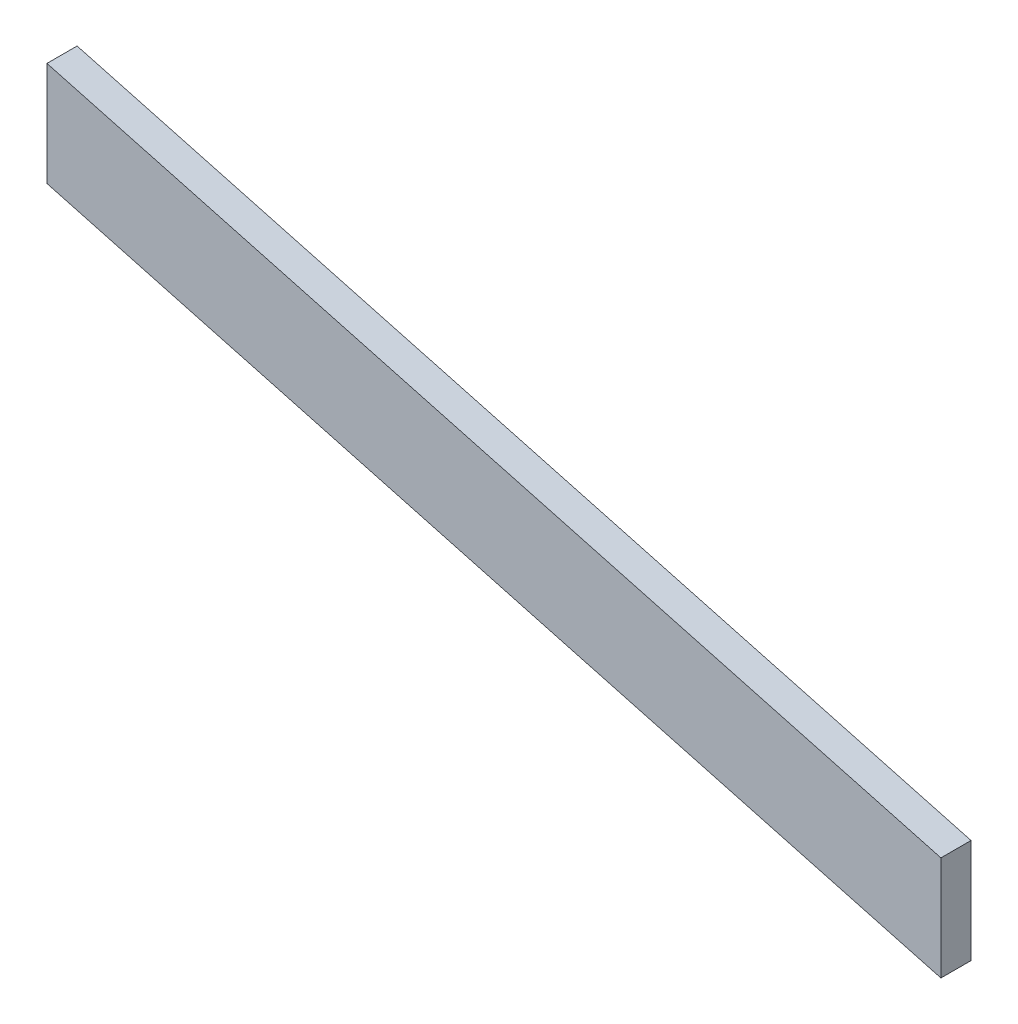
ISO-10303-21;
HEADER;
FILE_DESCRIPTION(('STEP AP214'),'2;1');
FILE_NAME('part.step','',(''),(''),'','','');
FILE_SCHEMA(('AUTOMOTIVE_DESIGN { 1 0 10303 214 1 1 1 1 }'));
ENDSEC;
DATA;
#1=APPLICATION_CONTEXT('core data for automotive mechanical design processes');
#2=APPLICATION_PROTOCOL_DEFINITION('international standard','automotive_design',2000,#1);
#3=PRODUCT_CONTEXT('',#1,'mechanical');
#4=PRODUCT('Part','Part','',(#3));
#5=PRODUCT_RELATED_PRODUCT_CATEGORY('part','',(#4));
#6=PRODUCT_DEFINITION_FORMATION('','',#4);
#7=PRODUCT_DEFINITION_CONTEXT('part definition',#1,'design');
#8=PRODUCT_DEFINITION('design','',#6,#7);
#9=PRODUCT_DEFINITION_SHAPE('','',#8);
#10=(LENGTH_UNIT() NAMED_UNIT(*) SI_UNIT(.MILLI.,.METRE.));
#11=(NAMED_UNIT(*) PLANE_ANGLE_UNIT() SI_UNIT($,.RADIAN.));
#12=(NAMED_UNIT(*) SI_UNIT($,.STERADIAN.) SOLID_ANGLE_UNIT());
#13=UNCERTAINTY_MEASURE_WITH_UNIT(LENGTH_MEASURE(1.E-05),#10,'distance_accuracy_value','');
#14=(GEOMETRIC_REPRESENTATION_CONTEXT(3) GLOBAL_UNCERTAINTY_ASSIGNED_CONTEXT((#13)) GLOBAL_UNIT_ASSIGNED_CONTEXT((#10,
#11,#12)) REPRESENTATION_CONTEXT('',''));
#15=CARTESIAN_POINT('',(0.,0.,0.));
#16=DIRECTION('',(0.,0.,1.));
#17=DIRECTION('',(1.,0.,0.));
#18=AXIS2_PLACEMENT_3D('',#15,#16,#17);
#19=CARTESIAN_POINT('',(-768.934498249528,966.966301204233,19.05));
#20=DIRECTION('',(-0.260362499760678,-0.965510936612512,0.));
#21=DIRECTION('',(0.965510936612513,-0.260362499760678,0.));
#22=AXIS2_PLACEMENT_3D('',#19,#20,#21);
#23=PLANE('',#22);
#24=DIRECTION('',(-0.965510936612513,0.260362499760678,0.));
#25=VECTOR('',#24,1.);
#26=CARTESIAN_POINT('',(-768.934498249528,966.966301204233,0.));
#27=LINE('',#26,#25);
#28=CARTESIAN_POINT('',(-203.784498249527,814.566301204233,0.));
#29=VERTEX_POINT('',#28);
#30=CARTESIAN_POINT('',(-768.934498249528,966.966301204233,0.));
#31=VERTEX_POINT('',#30);
#32=EDGE_CURVE('E95',#29,#31,#27,.T.);
#33=ORIENTED_EDGE('',*,*,#32,.T.);
#34=DIRECTION('',(0.,0.,-1.));
#35=VECTOR('',#34,1.);
#36=CARTESIAN_POINT('',(-768.934498249528,966.966301204233,19.05));
#37=LINE('',#36,#35);
#38=CARTESIAN_POINT('',(-768.934498249528,966.966301204233,19.05));
#39=VERTEX_POINT('',#38);
#40=EDGE_CURVE('E11',#39,#31,#37,.T.);
#41=ORIENTED_EDGE('',*,*,#40,.F.);
#42=DIRECTION('',(-0.965510936612513,0.260362499760678,0.));
#43=VECTOR('',#42,1.);
#44=CARTESIAN_POINT('',(-768.934498249528,966.966301204233,19.05));
#45=LINE('',#44,#43);
#46=CARTESIAN_POINT('',(-203.784498249527,814.566301204233,19.05));
#47=VERTEX_POINT('',#46);
#48=EDGE_CURVE('E83',#47,#39,#45,.T.);
#49=ORIENTED_EDGE('',*,*,#48,.F.);
#50=DIRECTION('',(0.,0.,-1.));
#51=VECTOR('',#50,1.);
#52=CARTESIAN_POINT('',(-203.784498249527,814.566301204233,19.05));
#53=LINE('',#52,#51);
#54=EDGE_CURVE('E91',#47,#29,#53,.T.);
#55=ORIENTED_EDGE('',*,*,#54,.T.);
#56=EDGE_LOOP('',(#33,#41,#49,#55));
#57=FACE_BOUND('',#56,.T.);
#58=ADVANCED_FACE('F32',(#57),#23,.F.);
#59=CARTESIAN_POINT('',(-768.934498249528,901.198014598605,19.05));
#60=DIRECTION('',(1.,0.,0.));
#61=DIRECTION('',(0.,0.,-1.));
#62=AXIS2_PLACEMENT_3D('',#59,#60,#61);
#63=PLANE('',#62);
#64=DIRECTION('',(0.,-1.,0.));
#65=VECTOR('',#64,1.);
#66=CARTESIAN_POINT('',(-768.934498249528,901.198014598605,0.));
#67=LINE('',#66,#65);
#68=CARTESIAN_POINT('',(-768.934498249528,901.198014598605,0.));
#69=VERTEX_POINT('',#68);
#70=EDGE_CURVE('E87',#31,#69,#67,.T.);
#71=ORIENTED_EDGE('',*,*,#70,.T.);
#72=DIRECTION('',(0.,0.,-1.));
#73=VECTOR('',#72,1.);
#74=CARTESIAN_POINT('',(-768.934498249528,901.198014598605,19.05));
#75=LINE('',#74,#73);
#76=CARTESIAN_POINT('',(-768.934498249528,901.198014598605,19.05));
#77=VERTEX_POINT('',#76);
#78=EDGE_CURVE('E40',#77,#69,#75,.T.);
#79=ORIENTED_EDGE('',*,*,#78,.F.);
#80=DIRECTION('',(0.,-1.,0.));
#81=VECTOR('',#80,1.);
#82=CARTESIAN_POINT('',(-768.934498249528,901.198014598605,19.05));
#83=LINE('',#82,#81);
#84=EDGE_CURVE('E78',#39,#77,#83,.T.);
#85=ORIENTED_EDGE('',*,*,#84,.F.);
#86=ORIENTED_EDGE('',*,*,#40,.T.);
#87=EDGE_LOOP('',(#71,#79,#85,#86));
#88=FACE_BOUND('',#87,.T.);
#89=ADVANCED_FACE('F86',(#88),#63,.F.);
#90=CARTESIAN_POINT('',(-768.934498249528,901.198014598605,19.05));
#91=DIRECTION('',(0.260362499760678,0.965510936612512,0.));
#92=DIRECTION('',(-0.965510936612513,0.260362499760678,0.));
#93=AXIS2_PLACEMENT_3D('',#90,#91,#92);
#94=PLANE('',#93);
#95=DIRECTION('',(0.965510936612513,-0.260362499760678,0.));
#96=VECTOR('',#95,1.);
#97=CARTESIAN_POINT('',(-768.934498249528,901.198014598605,0.));
#98=LINE('',#97,#96);
#99=CARTESIAN_POINT('',(-203.784498249528,748.798014598605,0.));
#100=VERTEX_POINT('',#99);
#101=EDGE_CURVE('E65',#69,#100,#98,.T.);
#102=ORIENTED_EDGE('',*,*,#101,.T.);
#103=DIRECTION('',(0.,0.,-1.));
#104=VECTOR('',#103,1.);
#105=CARTESIAN_POINT('',(-203.784498249528,748.798014598605,19.05));
#106=LINE('',#105,#104);
#107=CARTESIAN_POINT('',(-203.784498249528,748.798014598605,19.05));
#108=VERTEX_POINT('',#107);
#109=EDGE_CURVE('E88',#108,#100,#106,.T.);
#110=ORIENTED_EDGE('',*,*,#109,.F.);
#111=DIRECTION('',(0.965510936612513,-0.260362499760678,0.));
#112=VECTOR('',#111,1.);
#113=CARTESIAN_POINT('',(-768.934498249528,901.198014598605,19.05));
#114=LINE('',#113,#112);
#115=EDGE_CURVE('E81',#77,#108,#114,.T.);
#116=ORIENTED_EDGE('',*,*,#115,.F.);
#117=ORIENTED_EDGE('',*,*,#78,.T.);
#118=EDGE_LOOP('',(#102,#110,#116,#117));
#119=FACE_BOUND('',#118,.T.);
#120=ADVANCED_FACE('F89',(#119),#94,.F.);
#121=CARTESIAN_POINT('',(-203.784498249528,748.798014598605,19.05));
#122=DIRECTION('',(-1.,0.,0.));
#123=DIRECTION('',(0.,-1.,0.));
#124=AXIS2_PLACEMENT_3D('',#121,#122,#123);
#125=PLANE('',#124);
#126=DIRECTION('',(0.,1.,0.));
#127=VECTOR('',#126,1.);
#128=CARTESIAN_POINT('',(-203.784498249528,748.798014598605,0.));
#129=LINE('',#128,#127);
#130=EDGE_CURVE('E71',#100,#29,#129,.T.);
#131=ORIENTED_EDGE('',*,*,#130,.T.);
#132=ORIENTED_EDGE('',*,*,#54,.F.);
#133=DIRECTION('',(0.,1.,0.));
#134=VECTOR('',#133,1.);
#135=CARTESIAN_POINT('',(-203.784498249528,748.798014598605,19.05));
#136=LINE('',#135,#134);
#137=EDGE_CURVE('E48',#108,#47,#136,.T.);
#138=ORIENTED_EDGE('',*,*,#137,.F.);
#139=ORIENTED_EDGE('',*,*,#109,.T.);
#140=EDGE_LOOP('',(#131,#132,#138,#139));
#141=FACE_BOUND('',#140,.T.);
#142=ADVANCED_FACE('F102',(#141),#125,.F.);
#143=CARTESIAN_POINT('',(0.,0.,19.05));
#144=DIRECTION('',(0.,0.,1.));
#145=DIRECTION('',(1.,0.,0.));
#146=AXIS2_PLACEMENT_3D('',#143,#144,#145);
#147=PLANE('',#146);
#148=ORIENTED_EDGE('',*,*,#48,.T.);
#149=ORIENTED_EDGE('',*,*,#84,.T.);
#150=ORIENTED_EDGE('',*,*,#115,.T.);
#151=ORIENTED_EDGE('',*,*,#137,.T.);
#152=EDGE_LOOP('',(#148,#149,#150,#151));
#153=FACE_BOUND('',#152,.T.);
#154=ADVANCED_FACE('F79',(#153),#147,.T.);
#155=CARTESIAN_POINT('',(0.,0.,0.));
#156=DIRECTION('',(0.,0.,1.));
#157=DIRECTION('',(1.,0.,0.));
#158=AXIS2_PLACEMENT_3D('',#155,#156,#157);
#159=PLANE('',#158);
#160=ORIENTED_EDGE('',*,*,#32,.F.);
#161=ORIENTED_EDGE('',*,*,#130,.F.);
#162=ORIENTED_EDGE('',*,*,#101,.F.);
#163=ORIENTED_EDGE('',*,*,#70,.F.);
#164=EDGE_LOOP('',(#160,#161,#162,#163));
#165=FACE_BOUND('',#164,.T.);
#166=ADVANCED_FACE('F105',(#165),#159,.F.);
#167=CLOSED_SHELL('',(#58,#89,#120,#142,#154,#166));
#168=MANIFOLD_SOLID_BREP('B2',#167);
#169=ADVANCED_BREP_SHAPE_REPRESENTATION('',(#18,#168),#14);
#170=SHAPE_DEFINITION_REPRESENTATION(#9,#169);
ENDSEC;
END-ISO-10303-21;
